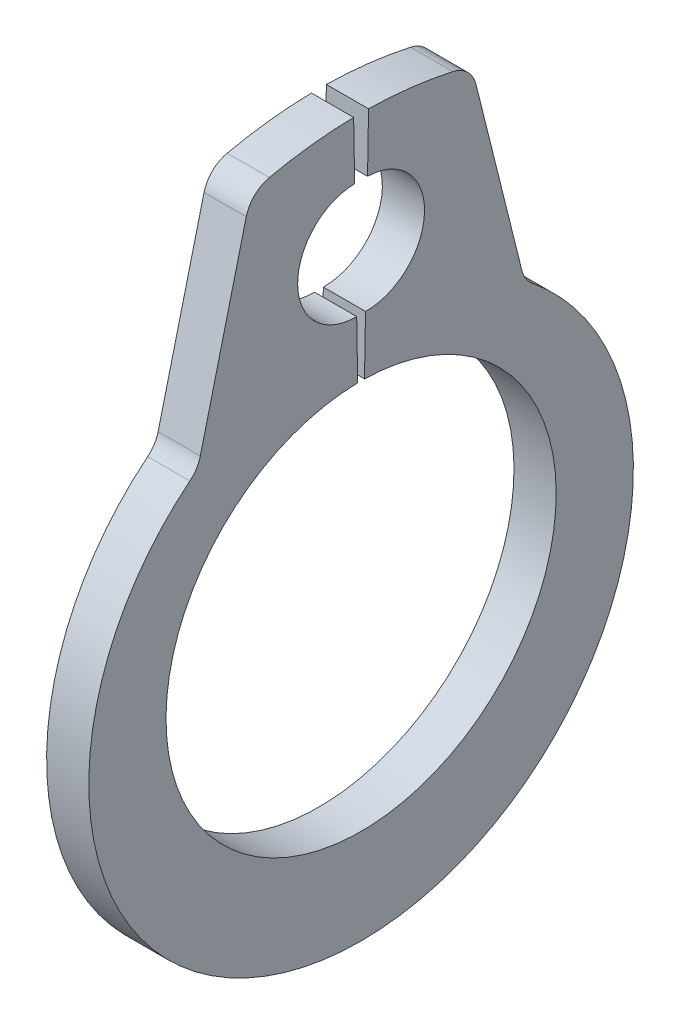
ISO-10303-21;
HEADER;
FILE_DESCRIPTION(('STEP AP214'),'2;1');
FILE_NAME('part.step','',(''),(''),'','','');
FILE_SCHEMA(('AUTOMOTIVE_DESIGN { 1 0 10303 214 1 1 1 1 }'));
ENDSEC;
DATA;
#1=APPLICATION_CONTEXT('core data for automotive mechanical design processes');
#2=APPLICATION_PROTOCOL_DEFINITION('international standard','automotive_design',2000,#1);
#3=PRODUCT_CONTEXT('',#1,'mechanical');
#4=PRODUCT('Part','Part','',(#3));
#5=PRODUCT_RELATED_PRODUCT_CATEGORY('part','',(#4));
#6=PRODUCT_DEFINITION_FORMATION('','',#4);
#7=PRODUCT_DEFINITION_CONTEXT('part definition',#1,'design');
#8=PRODUCT_DEFINITION('design','',#6,#7);
#9=PRODUCT_DEFINITION_SHAPE('','',#8);
#10=(LENGTH_UNIT() NAMED_UNIT(*) SI_UNIT(.MILLI.,.METRE.));
#11=(NAMED_UNIT(*) PLANE_ANGLE_UNIT() SI_UNIT($,.RADIAN.));
#12=(NAMED_UNIT(*) SI_UNIT($,.STERADIAN.) SOLID_ANGLE_UNIT());
#13=UNCERTAINTY_MEASURE_WITH_UNIT(LENGTH_MEASURE(1.E-05),#10,'distance_accuracy_value','');
#14=(GEOMETRIC_REPRESENTATION_CONTEXT(3) GLOBAL_UNCERTAINTY_ASSIGNED_CONTEXT((#13)) GLOBAL_UNIT_ASSIGNED_CONTEXT((#10,
#11,#12)) REPRESENTATION_CONTEXT('',''));
#15=CARTESIAN_POINT('',(0.,0.,0.));
#16=DIRECTION('',(0.,0.,1.));
#17=DIRECTION('',(1.,0.,0.));
#18=AXIS2_PLACEMENT_3D('',#15,#16,#17);
#19=CARTESIAN_POINT('',(0.2,0.,0.));
#20=DIRECTION('',(-1.,0.,0.));
#21=DIRECTION('',(0.,0.,1.));
#22=AXIS2_PLACEMENT_3D('',#19,#20,#21);
#23=CYLINDRICAL_SURFACE('',#22,1.85);
#24=CARTESIAN_POINT('',(-0.2,0.,0.));
#25=DIRECTION('',(-1.,0.,0.));
#26=DIRECTION('',(0.,0.,-1.));
#27=AXIS2_PLACEMENT_3D('',#24,#25,#26);
#28=CIRCLE('',#27,1.85);
#29=CARTESIAN_POINT('',(-0.2,1.84971823603932,-0.0322869519089746));
#30=VERTEX_POINT('',#29);
#31=CARTESIAN_POINT('',(-0.2,1.84971823603932,0.0322869519089746));
#32=VERTEX_POINT('',#31);
#33=EDGE_CURVE('E171',#30,#32,#28,.T.);
#34=ORIENTED_EDGE('',*,*,#33,.T.);
#35=DIRECTION('',(-1.,0.,0.));
#36=VECTOR('',#35,1.);
#37=CARTESIAN_POINT('',(0.2,1.84971823603932,0.0322869519089746));
#38=LINE('',#37,#36);
#39=CARTESIAN_POINT('',(0.2,1.84971823603932,0.0322869519089746));
#40=VERTEX_POINT('',#39);
#41=EDGE_CURVE('E152',#40,#32,#38,.T.);
#42=ORIENTED_EDGE('',*,*,#41,.F.);
#43=CARTESIAN_POINT('',(0.2,0.,0.));
#44=DIRECTION('',(-1.,0.,0.));
#45=DIRECTION('',(0.,0.,-1.));
#46=AXIS2_PLACEMENT_3D('',#43,#44,#45);
#47=CIRCLE('',#46,1.85);
#48=CARTESIAN_POINT('',(0.2,1.84971823603932,-0.0322869519089746));
#49=VERTEX_POINT('',#48);
#50=EDGE_CURVE('E158',#49,#40,#47,.T.);
#51=ORIENTED_EDGE('',*,*,#50,.F.);
#52=DIRECTION('',(-1.,0.,0.));
#53=VECTOR('',#52,1.);
#54=CARTESIAN_POINT('',(0.2,1.84971823603932,-0.0322869519089746));
#55=LINE('',#54,#53);
#56=EDGE_CURVE('E240',#49,#30,#55,.T.);
#57=ORIENTED_EDGE('',*,*,#56,.T.);
#58=EDGE_LOOP('',(#34,#42,#51,#57));
#59=FACE_BOUND('',#58,.T.);
#60=ADVANCED_FACE('F34',(#59),#23,.F.);
#61=CARTESIAN_POINT('',(0.2,2.39963446837534,0.0418857754494805));
#62=DIRECTION('',(0.,-0.0174524064372835,0.999847695156391));
#63=DIRECTION('',(0.,-0.999847695156391,-0.0174524064372835));
#64=AXIS2_PLACEMENT_3D('',#61,#62,#63);
#65=PLANE('',#64);
#66=DIRECTION('',(0.,0.999847695156391,0.0174524064372835));
#67=VECTOR('',#66,1.);
#68=CARTESIAN_POINT('',(-0.2,2.39963446837534,0.0418857754494805));
#69=LINE('',#68,#67);
#70=CARTESIAN_POINT('',(-0.2,2.39963446837534,0.0418857754494805));
#71=VERTEX_POINT('',#70);
#72=EDGE_CURVE('E242',#32,#71,#69,.T.);
#73=ORIENTED_EDGE('',*,*,#72,.T.);
#74=DIRECTION('',(-1.,0.,0.));
#75=VECTOR('',#74,1.);
#76=CARTESIAN_POINT('',(0.2,2.39963446837534,0.0418857754494805));
#77=LINE('',#76,#75);
#78=CARTESIAN_POINT('',(0.2,2.39963446837534,0.0418857754494805));
#79=VERTEX_POINT('',#78);
#80=EDGE_CURVE('E155',#79,#71,#77,.T.);
#81=ORIENTED_EDGE('',*,*,#80,.F.);
#82=DIRECTION('',(0.,0.999847695156391,0.0174524064372835));
#83=VECTOR('',#82,1.);
#84=CARTESIAN_POINT('',(0.2,2.39963446837534,0.0418857754494805));
#85=LINE('',#84,#83);
#86=EDGE_CURVE('E148',#40,#79,#85,.T.);
#87=ORIENTED_EDGE('',*,*,#86,.F.);
#88=ORIENTED_EDGE('',*,*,#41,.T.);
#89=EDGE_LOOP('',(#73,#81,#87,#88));
#90=FACE_BOUND('',#89,.T.);
#91=ADVANCED_FACE('F150',(#90),#65,.F.);
#92=CARTESIAN_POINT('',(0.2,2.94955070071135,0.0514845989899865));
#93=DIRECTION('',(-1.,0.,0.));
#94=DIRECTION('',(0.,0.,1.));
#95=AXIS2_PLACEMENT_3D('',#92,#93,#94);
#96=CYLINDRICAL_SURFACE('',#95,0.55);
#97=CARTESIAN_POINT('',(-0.2,2.94955070071135,0.0514845989899865));
#98=DIRECTION('',(-1.,0.,0.));
#99=DIRECTION('',(0.,0.,1.));
#100=AXIS2_PLACEMENT_3D('',#97,#98,#99);
#101=CIRCLE('',#100,0.55);
#102=CARTESIAN_POINT('',(-0.2,3.49946693304737,0.0610834225304923));
#103=VERTEX_POINT('',#102);
#104=EDGE_CURVE('E244',#71,#103,#101,.T.);
#105=ORIENTED_EDGE('',*,*,#104,.T.);
#106=DIRECTION('',(-1.,0.,0.));
#107=VECTOR('',#106,1.);
#108=CARTESIAN_POINT('',(0.2,3.49946693304737,0.0610834225304923));
#109=LINE('',#108,#107);
#110=CARTESIAN_POINT('',(0.2,3.49946693304737,0.0610834225304923));
#111=VERTEX_POINT('',#110);
#112=EDGE_CURVE('E176',#111,#103,#109,.T.);
#113=ORIENTED_EDGE('',*,*,#112,.F.);
#114=CARTESIAN_POINT('',(0.2,2.94955070071135,0.0514845989899865));
#115=DIRECTION('',(-1.,0.,0.));
#116=DIRECTION('',(0.,0.,1.));
#117=AXIS2_PLACEMENT_3D('',#114,#115,#116);
#118=CIRCLE('',#117,0.55);
#119=EDGE_CURVE('E157',#79,#111,#118,.T.);
#120=ORIENTED_EDGE('',*,*,#119,.F.);
#121=ORIENTED_EDGE('',*,*,#80,.T.);
#122=EDGE_LOOP('',(#105,#113,#120,#121));
#123=FACE_BOUND('',#122,.T.);
#124=ADVANCED_FACE('F302',(#123),#96,.F.);
#125=CARTESIAN_POINT('',(0.2,3.49946693304737,0.0610834225304924));
#126=DIRECTION('',(0.,-0.0174524064372836,0.999847695156391));
#127=DIRECTION('',(0.,-0.999847695156391,-0.0174524064372836));
#128=AXIS2_PLACEMENT_3D('',#125,#126,#127);
#129=PLANE('',#128);
#130=DIRECTION('',(0.,0.999847695156391,0.0174524064372836));
#131=VECTOR('',#130,1.);
#132=CARTESIAN_POINT('',(-0.2,3.49946693304737,0.0610834225304924));
#133=LINE('',#132,#131);
#134=CARTESIAN_POINT('',(-0.2,4.04938316538338,0.0706822460709984));
#135=VERTEX_POINT('',#134);
#136=EDGE_CURVE('E246',#103,#135,#133,.T.);
#137=ORIENTED_EDGE('',*,*,#136,.T.);
#138=DIRECTION('',(-1.,0.,0.));
#139=VECTOR('',#138,1.);
#140=CARTESIAN_POINT('',(0.2,4.04938316538338,0.0706822460709984));
#141=LINE('',#140,#139);
#142=CARTESIAN_POINT('',(0.2,4.04938316538338,0.0706822460709984));
#143=VERTEX_POINT('',#142);
#144=EDGE_CURVE('E271',#143,#135,#141,.T.);
#145=ORIENTED_EDGE('',*,*,#144,.F.);
#146=DIRECTION('',(0.,0.999847695156391,0.0174524064372836));
#147=VECTOR('',#146,1.);
#148=CARTESIAN_POINT('',(0.2,3.49946693304737,0.0610834225304924));
#149=LINE('',#148,#147);
#150=EDGE_CURVE('E280',#111,#143,#149,.T.);
#151=ORIENTED_EDGE('',*,*,#150,.F.);
#152=ORIENTED_EDGE('',*,*,#112,.T.);
#153=EDGE_LOOP('',(#137,#145,#151,#152));
#154=FACE_BOUND('',#153,.T.);
#155=ADVANCED_FACE('F278',(#154),#129,.F.);
#156=CARTESIAN_POINT('',(0.2,0.,0.));
#157=DIRECTION('',(-1.,0.,0.));
#158=DIRECTION('',(0.,0.,1.));
#159=AXIS2_PLACEMENT_3D('',#156,#157,#158);
#160=CYLINDRICAL_SURFACE('',#159,4.05);
#161=CARTESIAN_POINT('',(-0.2,0.,0.));
#162=DIRECTION('',(1.,0.,0.));
#163=DIRECTION('',(0.,0.,-1.));
#164=AXIS2_PLACEMENT_3D('',#161,#162,#163);
#165=CIRCLE('',#164,4.05);
#166=CARTESIAN_POINT('',(-0.2,3.95543553775241,0.870074540878729));
#167=VERTEX_POINT('',#166);
#168=EDGE_CURVE('E248',#135,#167,#165,.T.);
#169=ORIENTED_EDGE('',*,*,#168,.T.);
#170=DIRECTION('',(-1.,0.,0.));
#171=VECTOR('',#170,1.);
#172=CARTESIAN_POINT('',(0.2,3.95543553775241,0.870074540878729));
#173=LINE('',#172,#171);
#174=CARTESIAN_POINT('',(0.2,3.95543553775241,0.870074540878729));
#175=VERTEX_POINT('',#174);
#176=EDGE_CURVE('E191',#167,#175,#173,.F.);
#177=ORIENTED_EDGE('',*,*,#176,.T.);
#178=CARTESIAN_POINT('',(0.2,0.,0.));
#179=DIRECTION('',(1.,0.,0.));
#180=DIRECTION('',(0.,0.,-1.));
#181=AXIS2_PLACEMENT_3D('',#178,#179,#180);
#182=CIRCLE('',#181,4.05);
#183=EDGE_CURVE('E295',#143,#175,#182,.T.);
#184=ORIENTED_EDGE('',*,*,#183,.F.);
#185=ORIENTED_EDGE('',*,*,#144,.T.);
#186=EDGE_LOOP('',(#169,#177,#184,#185));
#187=FACE_BOUND('',#186,.T.);
#188=ADVANCED_FACE('F286',(#187),#160,.T.);
#189=CARTESIAN_POINT('',(0.2,3.91238787086019,1.04676699792556));
#190=DIRECTION('',(0.,-0.241921895599665,-0.970295726275997));
#191=DIRECTION('',(0.,0.970295726275997,-0.241921895599665));
#192=AXIS2_PLACEMENT_3D('',#189,#190,#191);
#193=PLANE('',#192);
#194=DIRECTION('',(0.,-0.970295726275997,0.241921895599665));
#195=VECTOR('',#194,1.);
#196=CARTESIAN_POINT('',(-0.2,3.91238787086019,1.04676699792556));
#197=LINE('',#196,#195);
#198=CARTESIAN_POINT('',(-0.2,3.74236416995824,1.08915866770745));
#199=VERTEX_POINT('',#198);
#200=CARTESIAN_POINT('',(-0.2,1.99527260257338,1.52475751898768));
#201=VERTEX_POINT('',#200);
#202=EDGE_CURVE('E222',#199,#201,#197,.T.);
#203=ORIENTED_EDGE('',*,*,#202,.T.);
#204=DIRECTION('',(1.,0.,0.));
#205=VECTOR('',#204,1.);
#206=CARTESIAN_POINT('',(0.2,1.99527260257338,1.52475751898768));
#207=LINE('',#206,#205);
#208=CARTESIAN_POINT('',(0.2,1.99527260257338,1.52475751898768));
#209=VERTEX_POINT('',#208);
#210=EDGE_CURVE('E185',#201,#209,#207,.T.);
#211=ORIENTED_EDGE('',*,*,#210,.T.);
#212=DIRECTION('',(0.,-0.970295726275997,0.241921895599665));
#213=VECTOR('',#212,1.);
#214=CARTESIAN_POINT('',(0.2,3.91238787086019,1.04676699792556));
#215=LINE('',#214,#213);
#216=CARTESIAN_POINT('',(0.2,3.74236416995824,1.08915866770745));
#217=VERTEX_POINT('',#216);
#218=EDGE_CURVE('E232',#217,#209,#215,.T.);
#219=ORIENTED_EDGE('',*,*,#218,.F.);
#220=DIRECTION('',(-1.,0.,0.));
#221=VECTOR('',#220,1.);
#222=CARTESIAN_POINT('',(0.2,3.74236416995824,1.08915866770745));
#223=LINE('',#222,#221);
#224=EDGE_CURVE('E182',#217,#199,#223,.T.);
#225=ORIENTED_EDGE('',*,*,#224,.T.);
#226=EDGE_LOOP('',(#203,#211,#219,#225));
#227=FACE_BOUND('',#226,.T.);
#228=ADVANCED_FACE('F297',(#227),#193,.F.);
#229=CARTESIAN_POINT('',(0.2,-0.167806196705348,0.));
#230=DIRECTION('',(-1.,0.,0.));
#231=DIRECTION('',(0.,0.,1.));
#232=AXIS2_PLACEMENT_3D('',#229,#230,#231);
#233=CYLINDRICAL_SURFACE('',#232,2.58219380329465);
#234=CARTESIAN_POINT('',(0.2,-0.167806196705348,0.));
#235=DIRECTION('',(1.,0.,0.));
#236=DIRECTION('',(0.,0.,-1.));
#237=AXIS2_PLACEMENT_3D('',#234,#235,#236);
#238=CIRCLE('',#237,2.58219380329465);
#239=CARTESIAN_POINT('',(0.2,1.83994430349884,1.62378039361951));
#240=VERTEX_POINT('',#239);
#241=CARTESIAN_POINT('',(0.2,1.83994430349883,-1.62378039361952));
#242=VERTEX_POINT('',#241);
#243=EDGE_CURVE('E226',#240,#242,#238,.T.);
#244=ORIENTED_EDGE('',*,*,#243,.F.);
#245=DIRECTION('',(-1.,0.,0.));
#246=VECTOR('',#245,1.);
#247=CARTESIAN_POINT('',(0.2,1.83994430349884,1.62378039361951));
#248=LINE('',#247,#246);
#249=CARTESIAN_POINT('',(-0.2,1.83994430349884,1.62378039361951));
#250=VERTEX_POINT('',#249);
#251=EDGE_CURVE('E174',#240,#250,#248,.T.);
#252=ORIENTED_EDGE('',*,*,#251,.T.);
#253=CARTESIAN_POINT('',(-0.2,-0.167806196705348,0.));
#254=DIRECTION('',(1.,0.,0.));
#255=DIRECTION('',(0.,0.,-1.));
#256=AXIS2_PLACEMENT_3D('',#253,#254,#255);
#257=CIRCLE('',#256,2.58219380329465);
#258=CARTESIAN_POINT('',(-0.2,1.83994430349883,-1.62378039361952));
#259=VERTEX_POINT('',#258);
#260=EDGE_CURVE('E212',#250,#259,#257,.T.);
#261=ORIENTED_EDGE('',*,*,#260,.T.);
#262=DIRECTION('',(-1.,0.,0.));
#263=VECTOR('',#262,1.);
#264=CARTESIAN_POINT('',(0.2,1.83994430349883,-1.62378039361952));
#265=LINE('',#264,#263);
#266=EDGE_CURVE('E172',#259,#242,#265,.F.);
#267=ORIENTED_EDGE('',*,*,#266,.T.);
#268=EDGE_LOOP('',(#244,#252,#261,#267));
#269=FACE_BOUND('',#268,.T.);
#270=ADVANCED_FACE('F219',(#269),#233,.T.);
#271=CARTESIAN_POINT('',(0.2,3.91238787086018,-1.04676699792556));
#272=DIRECTION('',(0.,-0.241921895599666,0.970295726275997));
#273=DIRECTION('',(0.,-0.970295726275997,-0.241921895599666));
#274=AXIS2_PLACEMENT_3D('',#271,#272,#273);
#275=PLANE('',#274);
#276=DIRECTION('',(0.,0.970295726275997,0.241921895599666));
#277=VECTOR('',#276,1.);
#278=CARTESIAN_POINT('',(-0.2,3.91238787086018,-1.04676699792556));
#279=LINE('',#278,#277);
#280=CARTESIAN_POINT('',(-0.2,1.99527260257337,-1.52475751898768));
#281=VERTEX_POINT('',#280);
#282=CARTESIAN_POINT('',(-0.2,3.74236416995823,-1.08915866770745));
#283=VERTEX_POINT('',#282);
#284=EDGE_CURVE('E213',#281,#283,#279,.T.);
#285=ORIENTED_EDGE('',*,*,#284,.T.);
#286=DIRECTION('',(-1.,0.,0.));
#287=VECTOR('',#286,1.);
#288=CARTESIAN_POINT('',(0.2,3.74236416995823,-1.08915866770745));
#289=LINE('',#288,#287);
#290=CARTESIAN_POINT('',(0.2,3.74236416995823,-1.08915866770745));
#291=VERTEX_POINT('',#290);
#292=EDGE_CURVE('E57',#283,#291,#289,.F.);
#293=ORIENTED_EDGE('',*,*,#292,.T.);
#294=DIRECTION('',(0.,0.970295726275997,0.241921895599666));
#295=VECTOR('',#294,1.);
#296=CARTESIAN_POINT('',(0.2,3.91238787086018,-1.04676699792556));
#297=LINE('',#296,#295);
#298=CARTESIAN_POINT('',(0.2,1.99527260257337,-1.52475751898768));
#299=VERTEX_POINT('',#298);
#300=EDGE_CURVE('E225',#299,#291,#297,.T.);
#301=ORIENTED_EDGE('',*,*,#300,.F.);
#302=DIRECTION('',(1.,0.,0.));
#303=VECTOR('',#302,1.);
#304=CARTESIAN_POINT('',(-0.2,1.99527260257337,-1.52475751898768));
#305=LINE('',#304,#303);
#306=EDGE_CURVE('E199',#299,#281,#305,.F.);
#307=ORIENTED_EDGE('',*,*,#306,.T.);
#308=EDGE_LOOP('',(#285,#293,#301,#307));
#309=FACE_BOUND('',#308,.T.);
#310=ADVANCED_FACE('F227',(#309),#275,.F.);
#311=CARTESIAN_POINT('',(0.2,0.,0.));
#312=DIRECTION('',(-1.,0.,0.));
#313=DIRECTION('',(0.,0.,1.));
#314=AXIS2_PLACEMENT_3D('',#311,#312,#313);
#315=CYLINDRICAL_SURFACE('',#314,4.05);
#316=CARTESIAN_POINT('',(0.2,0.,0.));
#317=DIRECTION('',(1.,0.,0.));
#318=DIRECTION('',(0.,0.,1.));
#319=AXIS2_PLACEMENT_3D('',#316,#317,#318);
#320=CIRCLE('',#319,4.05);
#321=CARTESIAN_POINT('',(0.2,3.9554355377524,-0.87007454087873));
#322=VERTEX_POINT('',#321);
#323=CARTESIAN_POINT('',(0.2,4.04938316538338,-0.0706822460709989));
#324=VERTEX_POINT('',#323);
#325=EDGE_CURVE('E228',#322,#324,#320,.T.);
#326=ORIENTED_EDGE('',*,*,#325,.F.);
#327=DIRECTION('',(-1.,0.,0.));
#328=VECTOR('',#327,1.);
#329=CARTESIAN_POINT('',(0.2,3.9554355377524,-0.87007454087873));
#330=LINE('',#329,#328);
#331=CARTESIAN_POINT('',(-0.2,3.9554355377524,-0.87007454087873));
#332=VERTEX_POINT('',#331);
#333=EDGE_CURVE('E196',#322,#332,#330,.T.);
#334=ORIENTED_EDGE('',*,*,#333,.T.);
#335=CARTESIAN_POINT('',(-0.2,0.,0.));
#336=DIRECTION('',(1.,0.,0.));
#337=DIRECTION('',(0.,0.,1.));
#338=AXIS2_PLACEMENT_3D('',#335,#336,#337);
#339=CIRCLE('',#338,4.05);
#340=CARTESIAN_POINT('',(-0.2,4.04938316538338,-0.0706822460709989));
#341=VERTEX_POINT('',#340);
#342=EDGE_CURVE('E254',#332,#341,#339,.T.);
#343=ORIENTED_EDGE('',*,*,#342,.T.);
#344=DIRECTION('',(-1.,0.,0.));
#345=VECTOR('',#344,1.);
#346=CARTESIAN_POINT('',(0.2,4.04938316538338,-0.0706822460709989));
#347=LINE('',#346,#345);
#348=EDGE_CURVE('E268',#324,#341,#347,.T.);
#349=ORIENTED_EDGE('',*,*,#348,.F.);
#350=EDGE_LOOP('',(#326,#334,#343,#349));
#351=FACE_BOUND('',#350,.T.);
#352=ADVANCED_FACE('F330',(#351),#315,.T.);
#353=CARTESIAN_POINT('',(0.2,3.49946693304737,-0.0610834225304929));
#354=DIRECTION('',(0.,-0.0174524064372837,-0.999847695156391));
#355=DIRECTION('',(0.,0.999847695156391,-0.0174524064372837));
#356=AXIS2_PLACEMENT_3D('',#353,#354,#355);
#357=PLANE('',#356);
#358=DIRECTION('',(0.,-0.999847695156391,0.0174524064372837));
#359=VECTOR('',#358,1.);
#360=CARTESIAN_POINT('',(-0.2,3.49946693304737,-0.0610834225304929));
#361=LINE('',#360,#359);
#362=CARTESIAN_POINT('',(-0.2,3.49946693304737,-0.0610834225304929));
#363=VERTEX_POINT('',#362);
#364=EDGE_CURVE('E256',#341,#363,#361,.T.);
#365=ORIENTED_EDGE('',*,*,#364,.T.);
#366=DIRECTION('',(-1.,0.,0.));
#367=VECTOR('',#366,1.);
#368=CARTESIAN_POINT('',(0.2,3.49946693304737,-0.0610834225304929));
#369=LINE('',#368,#367);
#370=CARTESIAN_POINT('',(0.2,3.49946693304737,-0.0610834225304929));
#371=VERTEX_POINT('',#370);
#372=EDGE_CURVE('E265',#371,#363,#369,.T.);
#373=ORIENTED_EDGE('',*,*,#372,.F.);
#374=DIRECTION('',(0.,-0.999847695156391,0.0174524064372837));
#375=VECTOR('',#374,1.);
#376=CARTESIAN_POINT('',(0.2,3.49946693304737,-0.0610834225304929));
#377=LINE('',#376,#375);
#378=EDGE_CURVE('E230',#324,#371,#377,.T.);
#379=ORIENTED_EDGE('',*,*,#378,.F.);
#380=ORIENTED_EDGE('',*,*,#348,.T.);
#381=EDGE_LOOP('',(#365,#373,#379,#380));
#382=FACE_BOUND('',#381,.T.);
#383=ADVANCED_FACE('F337',(#382),#357,.F.);
#384=CARTESIAN_POINT('',(0.2,2.94955070071135,-0.0514845989899869));
#385=DIRECTION('',(-1.,0.,0.));
#386=DIRECTION('',(0.,0.,1.));
#387=AXIS2_PLACEMENT_3D('',#384,#385,#386);
#388=CYLINDRICAL_SURFACE('',#387,0.55);
#389=CARTESIAN_POINT('',(-0.2,2.94955070071135,-0.0514845989899869));
#390=DIRECTION('',(-1.,0.,0.));
#391=DIRECTION('',(0.,0.,1.));
#392=AXIS2_PLACEMENT_3D('',#389,#390,#391);
#393=CIRCLE('',#392,0.55);
#394=CARTESIAN_POINT('',(-0.2,2.39963446837534,-0.0418857754494811));
#395=VERTEX_POINT('',#394);
#396=EDGE_CURVE('E258',#363,#395,#393,.T.);
#397=ORIENTED_EDGE('',*,*,#396,.T.);
#398=DIRECTION('',(-1.,0.,0.));
#399=VECTOR('',#398,1.);
#400=CARTESIAN_POINT('',(0.2,2.39963446837534,-0.0418857754494811));
#401=LINE('',#400,#399);
#402=CARTESIAN_POINT('',(0.2,2.39963446837534,-0.0418857754494811));
#403=VERTEX_POINT('',#402);
#404=EDGE_CURVE('E262',#403,#395,#401,.T.);
#405=ORIENTED_EDGE('',*,*,#404,.F.);
#406=CARTESIAN_POINT('',(0.2,2.94955070071135,-0.0514845989899869));
#407=DIRECTION('',(-1.,0.,0.));
#408=DIRECTION('',(0.,0.,1.));
#409=AXIS2_PLACEMENT_3D('',#406,#407,#408);
#410=CIRCLE('',#409,0.55);
#411=EDGE_CURVE('E237',#371,#403,#410,.T.);
#412=ORIENTED_EDGE('',*,*,#411,.F.);
#413=ORIENTED_EDGE('',*,*,#372,.T.);
#414=EDGE_LOOP('',(#397,#405,#412,#413));
#415=FACE_BOUND('',#414,.T.);
#416=ADVANCED_FACE('F341',(#415),#388,.F.);
#417=CARTESIAN_POINT('',(0.2,1.84971823603932,-0.0322869519089746));
#418=DIRECTION('',(0.,-0.0174524064372842,-0.999847695156391));
#419=DIRECTION('',(0.,0.999847695156391,-0.0174524064372842));
#420=AXIS2_PLACEMENT_3D('',#417,#418,#419);
#421=PLANE('',#420);
#422=DIRECTION('',(0.,-0.999847695156391,0.0174524064372842));
#423=VECTOR('',#422,1.);
#424=CARTESIAN_POINT('',(-0.2,1.84971823603932,-0.0322869519089746));
#425=LINE('',#424,#423);
#426=EDGE_CURVE('E168',#395,#30,#425,.T.);
#427=ORIENTED_EDGE('',*,*,#426,.T.);
#428=ORIENTED_EDGE('',*,*,#56,.F.);
#429=DIRECTION('',(0.,-0.999847695156391,0.0174524064372842));
#430=VECTOR('',#429,1.);
#431=CARTESIAN_POINT('',(0.2,1.84971823603932,-0.0322869519089746));
#432=LINE('',#431,#430);
#433=EDGE_CURVE('E164',#403,#49,#432,.T.);
#434=ORIENTED_EDGE('',*,*,#433,.F.);
#435=ORIENTED_EDGE('',*,*,#404,.T.);
#436=EDGE_LOOP('',(#427,#428,#434,#435));
#437=FACE_BOUND('',#436,.T.);
#438=ADVANCED_FACE('F344',(#437),#421,.F.);
#439=CARTESIAN_POINT('',(0.2,0.,0.));
#440=DIRECTION('',(1.,0.,0.));
#441=DIRECTION('',(0.,0.,-1.));
#442=AXIS2_PLACEMENT_3D('',#439,#440,#441);
#443=PLANE('',#442);
#444=ORIENTED_EDGE('',*,*,#183,.T.);
#445=CARTESIAN_POINT('',(0.2,3.67220682023433,0.807772907087413));
#446=DIRECTION('',(1.,0.,0.));
#447=DIRECTION('',(0.,0.,-1.));
#448=AXIS2_PLACEMENT_3D('',#445,#446,#447);
#449=CIRCLE('',#448,0.29);
#450=EDGE_CURVE('E194',#175,#217,#449,.T.);
#451=ORIENTED_EDGE('',*,*,#450,.T.);
#452=ORIENTED_EDGE('',*,*,#218,.T.);
#453=CARTESIAN_POINT('',(0.2,2.06542995229728,1.80614327960772));
#454=DIRECTION('',(1.,0.,0.));
#455=DIRECTION('',(0.,0.,-1.));
#456=AXIS2_PLACEMENT_3D('',#453,#454,#455);
#457=CIRCLE('',#456,0.29);
#458=EDGE_CURVE('E205',#209,#240,#457,.F.);
#459=ORIENTED_EDGE('',*,*,#458,.T.);
#460=ORIENTED_EDGE('',*,*,#243,.T.);
#461=CARTESIAN_POINT('',(0.2,2.06542995229728,-1.80614327960772));
#462=DIRECTION('',(1.,0.,0.));
#463=DIRECTION('',(0.,0.,-1.));
#464=AXIS2_PLACEMENT_3D('',#461,#462,#463);
#465=CIRCLE('',#464,0.29);
#466=EDGE_CURVE('E11',#242,#299,#465,.F.);
#467=ORIENTED_EDGE('',*,*,#466,.T.);
#468=ORIENTED_EDGE('',*,*,#300,.T.);
#469=CARTESIAN_POINT('',(0.2,3.67220682023433,-0.807772907087413));
#470=DIRECTION('',(1.,0.,0.));
#471=DIRECTION('',(0.,0.,-1.));
#472=AXIS2_PLACEMENT_3D('',#469,#470,#471);
#473=CIRCLE('',#472,0.29);
#474=EDGE_CURVE('E49',#291,#322,#473,.T.);
#475=ORIENTED_EDGE('',*,*,#474,.T.);
#476=ORIENTED_EDGE('',*,*,#325,.T.);
#477=ORIENTED_EDGE('',*,*,#378,.T.);
#478=ORIENTED_EDGE('',*,*,#411,.T.);
#479=ORIENTED_EDGE('',*,*,#433,.T.);
#480=ORIENTED_EDGE('',*,*,#50,.T.);
#481=ORIENTED_EDGE('',*,*,#86,.T.);
#482=ORIENTED_EDGE('',*,*,#119,.T.);
#483=ORIENTED_EDGE('',*,*,#150,.T.);
#484=EDGE_LOOP('',(#444,#451,#452,#459,#460,#467,#468,#475,#476,#477,#478,#479,#480,#481,#482,#483));
#485=FACE_BOUND('',#484,.T.);
#486=ADVANCED_FACE('F162',(#485),#443,.T.);
#487=CARTESIAN_POINT('',(-0.2,0.,0.));
#488=DIRECTION('',(1.,0.,0.));
#489=DIRECTION('',(0.,0.,-1.));
#490=AXIS2_PLACEMENT_3D('',#487,#488,#489);
#491=PLANE('',#490);
#492=ORIENTED_EDGE('',*,*,#202,.F.);
#493=CARTESIAN_POINT('',(-0.2,3.67220682023433,0.807772907087413));
#494=DIRECTION('',(1.,0.,0.));
#495=DIRECTION('',(0.,0.,-1.));
#496=AXIS2_PLACEMENT_3D('',#493,#494,#495);
#497=CIRCLE('',#496,0.29);
#498=EDGE_CURVE('E189',#199,#167,#497,.F.);
#499=ORIENTED_EDGE('',*,*,#498,.T.);
#500=ORIENTED_EDGE('',*,*,#168,.F.);
#501=ORIENTED_EDGE('',*,*,#136,.F.);
#502=ORIENTED_EDGE('',*,*,#104,.F.);
#503=ORIENTED_EDGE('',*,*,#72,.F.);
#504=ORIENTED_EDGE('',*,*,#33,.F.);
#505=ORIENTED_EDGE('',*,*,#426,.F.);
#506=ORIENTED_EDGE('',*,*,#396,.F.);
#507=ORIENTED_EDGE('',*,*,#364,.F.);
#508=ORIENTED_EDGE('',*,*,#342,.F.);
#509=CARTESIAN_POINT('',(-0.2,3.67220682023433,-0.807772907087413));
#510=DIRECTION('',(1.,0.,0.));
#511=DIRECTION('',(0.,0.,-1.));
#512=AXIS2_PLACEMENT_3D('',#509,#510,#511);
#513=CIRCLE('',#512,0.29);
#514=EDGE_CURVE('E187',#332,#283,#513,.F.);
#515=ORIENTED_EDGE('',*,*,#514,.T.);
#516=ORIENTED_EDGE('',*,*,#284,.F.);
#517=CARTESIAN_POINT('',(-0.2,2.06542995229728,-1.80614327960772));
#518=DIRECTION('',(1.,0.,0.));
#519=DIRECTION('',(0.,0.,-1.));
#520=AXIS2_PLACEMENT_3D('',#517,#518,#519);
#521=CIRCLE('',#520,0.29);
#522=EDGE_CURVE('E42',#281,#259,#521,.T.);
#523=ORIENTED_EDGE('',*,*,#522,.T.);
#524=ORIENTED_EDGE('',*,*,#260,.F.);
#525=CARTESIAN_POINT('',(-0.2,2.06542995229728,1.80614327960772));
#526=DIRECTION('',(1.,0.,0.));
#527=DIRECTION('',(0.,0.,-1.));
#528=AXIS2_PLACEMENT_3D('',#525,#526,#527);
#529=CIRCLE('',#528,0.29);
#530=EDGE_CURVE('E203',#250,#201,#529,.T.);
#531=ORIENTED_EDGE('',*,*,#530,.T.);
#532=EDGE_LOOP('',(#492,#499,#500,#501,#502,#503,#504,#505,#506,#507,#508,#515,#516,#523,#524,#531));
#533=FACE_BOUND('',#532,.T.);
#534=ADVANCED_FACE('F211',(#533),#491,.F.);
#535=CARTESIAN_POINT('',(0.2,2.06542995229728,1.80614327960772));
#536=DIRECTION('',(-1.,0.,0.));
#537=DIRECTION('',(0.,0.,1.));
#538=AXIS2_PLACEMENT_3D('',#535,#536,#537);
#539=CYLINDRICAL_SURFACE('',#538,0.29);
#540=ORIENTED_EDGE('',*,*,#458,.F.);
#541=ORIENTED_EDGE('',*,*,#210,.F.);
#542=ORIENTED_EDGE('',*,*,#530,.F.);
#543=ORIENTED_EDGE('',*,*,#251,.F.);
#544=EDGE_LOOP('',(#540,#541,#542,#543));
#545=FACE_BOUND('',#544,.T.);
#546=ADVANCED_FACE('F316',(#545),#539,.F.);
#547=CARTESIAN_POINT('',(0.2,3.67220682023433,0.807772907087413));
#548=DIRECTION('',(-1.,0.,0.));
#549=DIRECTION('',(0.,0.,1.));
#550=AXIS2_PLACEMENT_3D('',#547,#548,#549);
#551=CYLINDRICAL_SURFACE('',#550,0.29);
#552=ORIENTED_EDGE('',*,*,#450,.F.);
#553=ORIENTED_EDGE('',*,*,#176,.F.);
#554=ORIENTED_EDGE('',*,*,#498,.F.);
#555=ORIENTED_EDGE('',*,*,#224,.F.);
#556=EDGE_LOOP('',(#552,#553,#554,#555));
#557=FACE_BOUND('',#556,.T.);
#558=ADVANCED_FACE('F290',(#557),#551,.T.);
#559=CARTESIAN_POINT('',(0.2,3.67220682023433,-0.807772907087413));
#560=DIRECTION('',(-1.,0.,0.));
#561=DIRECTION('',(0.,0.,1.));
#562=AXIS2_PLACEMENT_3D('',#559,#560,#561);
#563=CYLINDRICAL_SURFACE('',#562,0.29);
#564=ORIENTED_EDGE('',*,*,#474,.F.);
#565=ORIENTED_EDGE('',*,*,#292,.F.);
#566=ORIENTED_EDGE('',*,*,#514,.F.);
#567=ORIENTED_EDGE('',*,*,#333,.F.);
#568=EDGE_LOOP('',(#564,#565,#566,#567));
#569=FACE_BOUND('',#568,.T.);
#570=ADVANCED_FACE('F321',(#569),#563,.T.);
#571=CARTESIAN_POINT('',(0.2,2.06542995229728,-1.80614327960772));
#572=DIRECTION('',(-1.,0.,0.));
#573=DIRECTION('',(0.,0.,1.));
#574=AXIS2_PLACEMENT_3D('',#571,#572,#573);
#575=CYLINDRICAL_SURFACE('',#574,0.29);
#576=ORIENTED_EDGE('',*,*,#466,.F.);
#577=ORIENTED_EDGE('',*,*,#266,.F.);
#578=ORIENTED_EDGE('',*,*,#522,.F.);
#579=ORIENTED_EDGE('',*,*,#306,.F.);
#580=EDGE_LOOP('',(#576,#577,#578,#579));
#581=FACE_BOUND('',#580,.T.);
#582=ADVANCED_FACE('F36',(#581),#575,.F.);
#583=CLOSED_SHELL('',(#60,#91,#124,#155,#188,#228,#270,#310,#352,#383,#416,#438,#486,#534,#546,
#558,#570,#582));
#584=MANIFOLD_SOLID_BREP('B2',#583);
#585=ADVANCED_BREP_SHAPE_REPRESENTATION('',(#18,#584),#14);
#586=SHAPE_DEFINITION_REPRESENTATION(#9,#585);
ENDSEC;
END-ISO-10303-21;
